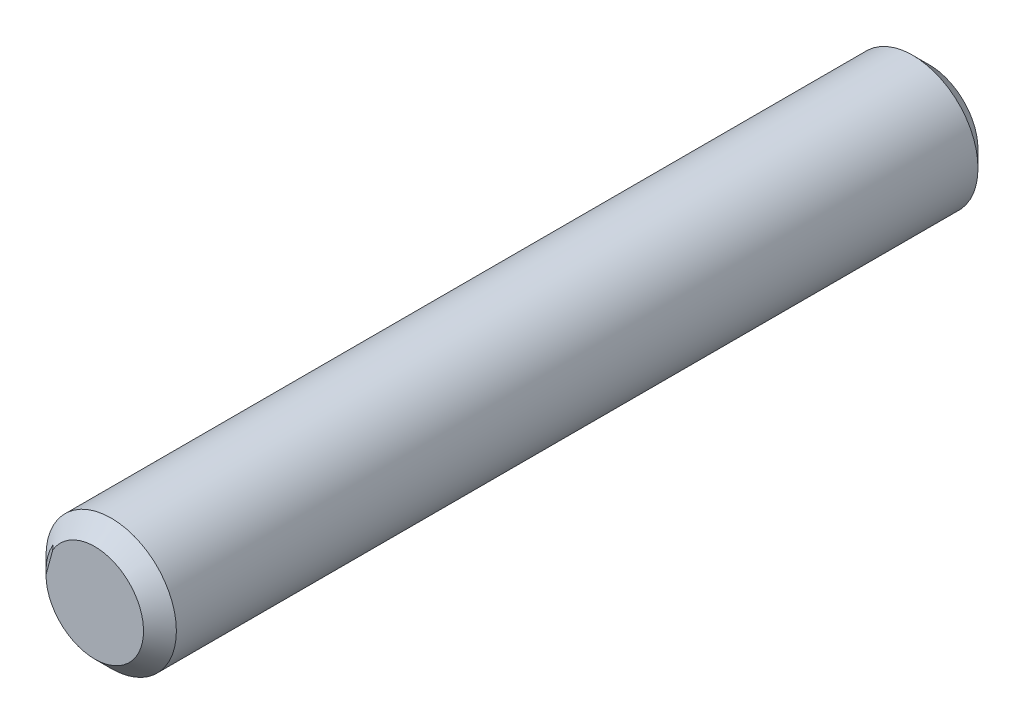
ISO-10303-21;
HEADER;
FILE_DESCRIPTION(('STEP AP214'),'2;1');
FILE_NAME('part.step','',(''),(''),'','','');
FILE_SCHEMA(('AUTOMOTIVE_DESIGN { 1 0 10303 214 1 1 1 1 }'));
ENDSEC;
DATA;
#1=APPLICATION_CONTEXT('core data for automotive mechanical design processes');
#2=APPLICATION_PROTOCOL_DEFINITION('international standard','automotive_design',2000,#1);
#3=PRODUCT_CONTEXT('',#1,'mechanical');
#4=PRODUCT('Part','Part','',(#3));
#5=PRODUCT_RELATED_PRODUCT_CATEGORY('part','',(#4));
#6=PRODUCT_DEFINITION_FORMATION('','',#4);
#7=PRODUCT_DEFINITION_CONTEXT('part definition',#1,'design');
#8=PRODUCT_DEFINITION('design','',#6,#7);
#9=PRODUCT_DEFINITION_SHAPE('','',#8);
#10=(LENGTH_UNIT() NAMED_UNIT(*) SI_UNIT(.MILLI.,.METRE.));
#11=(NAMED_UNIT(*) PLANE_ANGLE_UNIT() SI_UNIT($,.RADIAN.));
#12=(NAMED_UNIT(*) SI_UNIT($,.STERADIAN.) SOLID_ANGLE_UNIT());
#13=UNCERTAINTY_MEASURE_WITH_UNIT(LENGTH_MEASURE(1.E-05),#10,'distance_accuracy_value','');
#14=(GEOMETRIC_REPRESENTATION_CONTEXT(3) GLOBAL_UNCERTAINTY_ASSIGNED_CONTEXT((#13)) GLOBAL_UNIT_ASSIGNED_CONTEXT((#10,
#11,#12)) REPRESENTATION_CONTEXT('',''));
#15=CARTESIAN_POINT('',(0.,0.,0.));
#16=DIRECTION('',(0.,0.,1.));
#17=DIRECTION('',(1.,0.,0.));
#18=AXIS2_PLACEMENT_3D('',#15,#16,#17);
#19=CARTESIAN_POINT('',(0.,0.,12.7));
#20=DIRECTION('',(0.,0.,-1.));
#21=DIRECTION('',(-1.,0.,0.));
#22=AXIS2_PLACEMENT_3D('',#19,#20,#21);
#23=CYLINDRICAL_SURFACE('',#22,1.984375);
#24=CARTESIAN_POINT('',(0.,0.,-12.2));
#25=DIRECTION('',(0.,0.,1.));
#26=DIRECTION('',(1.,0.,0.));
#27=AXIS2_PLACEMENT_3D('',#24,#25,#26);
#28=CIRCLE('',#27,1.984375);
#29=CARTESIAN_POINT('',(1.984375,0.,-12.2));
#30=VERTEX_POINT('',#29);
#31=EDGE_CURVE('E94',#30,#30,#28,.T.);
#32=ORIENTED_EDGE('',*,*,#31,.T.);
#33=EDGE_LOOP('',(#32));
#34=FACE_BOUND('',#33,.T.);
#35=CARTESIAN_POINT('',(0.,0.,12.2));
#36=DIRECTION('',(0.,0.,1.));
#37=DIRECTION('',(1.,0.,0.));
#38=AXIS2_PLACEMENT_3D('',#35,#36,#37);
#39=CIRCLE('',#38,1.984375);
#40=CARTESIAN_POINT('',(1.984375,0.,12.2));
#41=VERTEX_POINT('',#40);
#42=EDGE_CURVE('E90',#41,#41,#39,.F.);
#43=ORIENTED_EDGE('',*,*,#42,.T.);
#44=EDGE_LOOP('',(#43));
#45=FACE_BOUND('',#44,.T.);
#46=ADVANCED_FACE('F32',(#34,#45),#23,.T.);
#47=CARTESIAN_POINT('',(0.,0.,12.7));
#48=DIRECTION('',(0.,0.,1.));
#49=DIRECTION('',(1.,0.,0.));
#50=AXIS2_PLACEMENT_3D('',#47,#48,#49);
#51=PLANE('',#50);
#52=DIRECTION('',(0.263045024481115,0.964783558678178,0.));
#53=VECTOR('',#52,1.);
#54=CARTESIAN_POINT('',(-2.25123983364902,-2.8126689896245,12.7));
#55=LINE('',#54,#53);
#56=CARTESIAN_POINT('',(-1.484375,0.,12.7));
#57=VERTEX_POINT('',#56);
#58=CARTESIAN_POINT('',(-1.27895921669045,0.75341387209658,12.7));
#59=VERTEX_POINT('',#58);
#60=EDGE_CURVE('E76',#57,#59,#55,.T.);
#61=ORIENTED_EDGE('',*,*,#60,.F.);
#62=CARTESIAN_POINT('',(0.,0.,12.7));
#63=DIRECTION('',(0.,0.,1.));
#64=DIRECTION('',(1.,0.,0.));
#65=AXIS2_PLACEMENT_3D('',#62,#63,#64);
#66=CIRCLE('',#65,1.484375);
#67=EDGE_CURVE('E100',#57,#59,#66,.T.);
#68=ORIENTED_EDGE('',*,*,#67,.T.);
#69=EDGE_LOOP('',(#61,#68));
#70=FACE_BOUND('',#69,.T.);
#71=ADVANCED_FACE('F115',(#70),#51,.T.);
#72=CARTESIAN_POINT('',(0.,0.,-12.7));
#73=DIRECTION('',(0.,0.,1.));
#74=DIRECTION('',(1.,0.,0.));
#75=AXIS2_PLACEMENT_3D('',#72,#73,#74);
#76=PLANE('',#75);
#77=CARTESIAN_POINT('',(0.,0.,-12.7));
#78=DIRECTION('',(0.,0.,1.));
#79=DIRECTION('',(1.,0.,0.));
#80=AXIS2_PLACEMENT_3D('',#77,#78,#79);
#81=CIRCLE('',#80,1.484375);
#82=CARTESIAN_POINT('',(1.484375,0.,-12.7));
#83=VERTEX_POINT('',#82);
#84=EDGE_CURVE('E97',#83,#83,#81,.F.);
#85=ORIENTED_EDGE('',*,*,#84,.T.);
#86=EDGE_LOOP('',(#85));
#87=FACE_BOUND('',#86,.T.);
#88=ADVANCED_FACE('F118',(#87),#76,.F.);
#89=CARTESIAN_POINT('',(0.,0.,-12.2));
#90=DIRECTION('',(0.,0.,1.));
#91=DIRECTION('',(1.,0.,0.));
#92=AXIS2_PLACEMENT_3D('',#89,#90,#91);
#93=CONICAL_SURFACE('',#92,1.984375,0.785398163397448);
#94=ORIENTED_EDGE('',*,*,#84,.F.);
#95=EDGE_LOOP('',(#94));
#96=FACE_BOUND('',#95,.T.);
#97=ORIENTED_EDGE('',*,*,#31,.F.);
#98=EDGE_LOOP('',(#97));
#99=FACE_BOUND('',#98,.T.);
#100=ADVANCED_FACE('F122',(#96,#99),#93,.T.);
#101=CARTESIAN_POINT('',(0.,0.,12.7));
#102=DIRECTION('',(0.,0.,-1.));
#103=DIRECTION('',(-1.,0.,0.));
#104=AXIS2_PLACEMENT_3D('',#101,#102,#103);
#105=CONICAL_SURFACE('',#104,1.484375,0.785398163397445);
#106=CARTESIAN_POINT('',(-1.58434058212543,0.0272552830745557,12.5998));
#107=CARTESIAN_POINT('',(-1.56766461657016,0.0227086365979716,12.6165529452497));
#108=CARTESIAN_POINT('',(-1.55097950203655,0.0181594956829075,12.6332960843699));
#109=CARTESIAN_POINT('',(-1.51759097466179,0.00905622488016483,12.6667627507031));
#110=CARTESIAN_POINT('',(-1.50088756182027,0.00450209499238147,12.6834862779156));
#111=CARTESIAN_POINT('',(-1.484175,-5.45293339866689E-05,12.7001999989983));
#112=B_SPLINE_CURVE_WITH_KNOTS('',3,(#106,#107,#108,#109,#110,#111),.UNSPECIFIED.,.F.,.F.,(4,2,
4),(0.,0.0722134609264608,0.144426923370518),.UNSPECIFIED.);
#113=CARTESIAN_POINT('',(-1.58414148554384,0.0272010000545901,12.6));
#114=VERTEX_POINT('',#113);
#115=EDGE_CURVE('E11',#114,#57,#112,.T.);
#116=ORIENTED_EDGE('',*,*,#115,.F.);
#117=CARTESIAN_POINT('',(0.,0.,12.6));
#118=DIRECTION('',(0.,0.,1.));
#119=DIRECTION('',(1.,0.,0.));
#120=AXIS2_PLACEMENT_3D('',#117,#118,#119);
#121=CIRCLE('',#120,1.584375);
#122=CARTESIAN_POINT('',(-1.37872570223428,0.78061487215117,12.6));
#123=VERTEX_POINT('',#122);
#124=EDGE_CURVE('E57',#114,#123,#121,.F.);
#125=ORIENTED_EDGE('',*,*,#124,.T.);
#126=CARTESIAN_POINT('',(-1.27875921669045,0.753359342762594,12.7001999989983));
#127=CARTESIAN_POINT('',(-1.29547177851071,0.757915967088962,12.6834862779156));
#128=CARTESIAN_POINT('',(-1.31217519135224,0.762470096976745,12.6667627507031));
#129=CARTESIAN_POINT('',(-1.345563718727,0.771573367779488,12.6332960843699));
#130=CARTESIAN_POINT('',(-1.36224883326061,0.776122508694552,12.6165529452497));
#131=CARTESIAN_POINT('',(-1.37892479881587,0.780669155171136,12.5998));
#132=B_SPLINE_CURVE_WITH_KNOTS('',3,(#126,#127,#128,#129,#130,#131),.UNSPECIFIED.,.F.,.F.,(4,2,
4),(0.,0.0722134624440569,0.144426923370516),.UNSPECIFIED.);
#133=EDGE_CURVE('E45',#59,#123,#132,.T.);
#134=ORIENTED_EDGE('',*,*,#133,.F.);
#135=ORIENTED_EDGE('',*,*,#67,.F.);
#136=EDGE_LOOP('',(#116,#125,#134,#135));
#137=FACE_BOUND('',#136,.T.);
#138=ORIENTED_EDGE('',*,*,#42,.F.);
#139=EDGE_LOOP('',(#138));
#140=FACE_BOUND('',#139,.T.);
#141=ADVANCED_FACE('F34',(#137,#140),#105,.T.);
#142=CARTESIAN_POINT('',(-2.25123983364902,-2.8126689896245,12.6));
#143=DIRECTION('',(0.964783558678178,-0.263045024481115,0.));
#144=DIRECTION('',(0.263045024481115,0.964783558678178,0.));
#145=AXIS2_PLACEMENT_3D('',#142,#143,#144);
#146=PLANE('',#145);
#147=ORIENTED_EDGE('',*,*,#60,.T.);
#148=DIRECTION('',(0.,0.,1.));
#149=VECTOR('',#148,1.);
#150=CARTESIAN_POINT('',(-1.27895921669045,0.75341387209658,12.6));
#151=LINE('',#150,#149);
#152=CARTESIAN_POINT('',(-1.27895921669045,0.75341387209658,12.6));
#153=VERTEX_POINT('',#152);
#154=EDGE_CURVE('E71',#153,#59,#151,.T.);
#155=ORIENTED_EDGE('',*,*,#154,.F.);
#156=DIRECTION('',(0.263045024481115,0.964783558678178,0.));
#157=VECTOR('',#156,1.);
#158=CARTESIAN_POINT('',(-2.25123983364902,-2.8126689896245,12.6));
#159=LINE('',#158,#157);
#160=CARTESIAN_POINT('',(-1.484375,0.,12.6));
#161=VERTEX_POINT('',#160);
#162=EDGE_CURVE('E74',#161,#153,#159,.T.);
#163=ORIENTED_EDGE('',*,*,#162,.F.);
#164=DIRECTION('',(0.,0.,1.));
#165=VECTOR('',#164,1.);
#166=CARTESIAN_POINT('',(-1.484375,0.,12.6));
#167=LINE('',#166,#165);
#168=EDGE_CURVE('E79',#161,#57,#167,.T.);
#169=ORIENTED_EDGE('',*,*,#168,.T.);
#170=EDGE_LOOP('',(#147,#155,#163,#169));
#171=FACE_BOUND('',#170,.T.);
#172=ADVANCED_FACE('F72',(#171),#146,.F.);
#173=CARTESIAN_POINT('',(0.754823495432389,-0.610510013101877,12.6));
#174=DIRECTION('',(-0.263045024481115,-0.964783558678178,0.));
#175=DIRECTION('',(0.964783558678178,-0.263045024481115,0.));
#176=AXIS2_PLACEMENT_3D('',#173,#174,#175);
#177=PLANE('',#176);
#178=ORIENTED_EDGE('',*,*,#115,.T.);
#179=ORIENTED_EDGE('',*,*,#168,.F.);
#180=DIRECTION('',(0.964783558678178,-0.263045024481115,0.));
#181=VECTOR('',#180,1.);
#182=CARTESIAN_POINT('',(0.754823495432389,-0.610510013101877,12.6));
#183=LINE('',#182,#181);
#184=EDGE_CURVE('E80',#114,#161,#183,.T.);
#185=ORIENTED_EDGE('',*,*,#184,.F.);
#186=EDGE_LOOP('',(#178,#179,#185));
#187=FACE_BOUND('',#186,.T.);
#188=ADVANCED_FACE('F110',(#187),#177,.F.);
#189=CARTESIAN_POINT('',(0.960239278741943,0.142903858994703,12.6));
#190=DIRECTION('',(0.263045024481115,0.964783558678178,0.));
#191=DIRECTION('',(-0.964783558678178,0.263045024481115,0.));
#192=AXIS2_PLACEMENT_3D('',#189,#190,#191);
#193=PLANE('',#192);
#194=ORIENTED_EDGE('',*,*,#133,.T.);
#195=DIRECTION('',(-0.964783558678178,0.263045024481115,0.));
#196=VECTOR('',#195,1.);
#197=CARTESIAN_POINT('',(0.960239278741943,0.142903858994703,12.6));
#198=LINE('',#197,#196);
#199=EDGE_CURVE('E52',#153,#123,#198,.T.);
#200=ORIENTED_EDGE('',*,*,#199,.F.);
#201=ORIENTED_EDGE('',*,*,#154,.T.);
#202=EDGE_LOOP('',(#194,#200,#201));
#203=FACE_BOUND('',#202,.T.);
#204=ADVANCED_FACE('F82',(#203),#193,.F.);
#205=CARTESIAN_POINT('',(-0.0120413382166308,-3.42317900272637,12.6));
#206=DIRECTION('',(0.,0.,1.));
#207=DIRECTION('',(1.,0.,0.));
#208=AXIS2_PLACEMENT_3D('',#205,#206,#207);
#209=PLANE('',#208);
#210=ORIENTED_EDGE('',*,*,#184,.T.);
#211=ORIENTED_EDGE('',*,*,#162,.T.);
#212=ORIENTED_EDGE('',*,*,#199,.T.);
#213=ORIENTED_EDGE('',*,*,#124,.F.);
#214=EDGE_LOOP('',(#210,#211,#212,#213));
#215=FACE_BOUND('',#214,.T.);
#216=ADVANCED_FACE('F84',(#215),#209,.T.);
#217=CLOSED_SHELL('',(#46,#71,#88,#100,#141,#172,#188,#204,#216));
#218=MANIFOLD_SOLID_BREP('B2',#217);
#219=ADVANCED_BREP_SHAPE_REPRESENTATION('',(#18,#218),#14);
#220=SHAPE_DEFINITION_REPRESENTATION(#9,#219);
ENDSEC;
END-ISO-10303-21;
